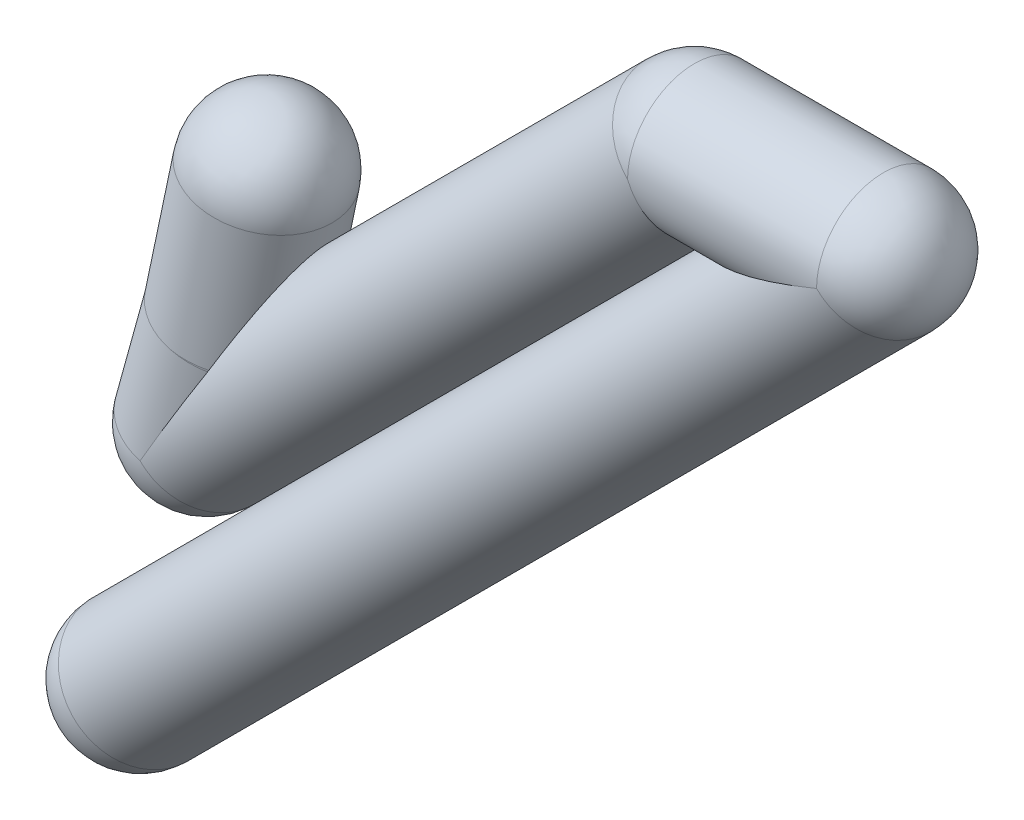
ISO-10303-21;
HEADER;
FILE_DESCRIPTION(('STEP AP214'),'2;1');
FILE_NAME('part.step','',(''),(''),'','','');
FILE_SCHEMA(('AUTOMOTIVE_DESIGN { 1 0 10303 214 1 1 1 1 }'));
ENDSEC;
DATA;
#1=APPLICATION_CONTEXT('core data for automotive mechanical design processes');
#2=APPLICATION_PROTOCOL_DEFINITION('international standard','automotive_design',2000,#1);
#3=PRODUCT_CONTEXT('',#1,'mechanical');
#4=PRODUCT('Part','Part','',(#3));
#5=PRODUCT_RELATED_PRODUCT_CATEGORY('part','',(#4));
#6=PRODUCT_DEFINITION_FORMATION('','',#4);
#7=PRODUCT_DEFINITION_CONTEXT('part definition',#1,'design');
#8=PRODUCT_DEFINITION('design','',#6,#7);
#9=PRODUCT_DEFINITION_SHAPE('','',#8);
#10=(LENGTH_UNIT() NAMED_UNIT(*) SI_UNIT(.MILLI.,.METRE.));
#11=(NAMED_UNIT(*) PLANE_ANGLE_UNIT() SI_UNIT($,.RADIAN.));
#12=(NAMED_UNIT(*) SI_UNIT($,.STERADIAN.) SOLID_ANGLE_UNIT());
#13=UNCERTAINTY_MEASURE_WITH_UNIT(LENGTH_MEASURE(1.E-05),#10,'distance_accuracy_value','');
#14=(GEOMETRIC_REPRESENTATION_CONTEXT(3) GLOBAL_UNCERTAINTY_ASSIGNED_CONTEXT((#13)) GLOBAL_UNIT_ASSIGNED_CONTEXT((#10,
#11,#12)) REPRESENTATION_CONTEXT('',''));
#15=CARTESIAN_POINT('',(0.,0.,0.));
#16=DIRECTION('',(0.,0.,1.));
#17=DIRECTION('',(1.,0.,0.));
#18=AXIS2_PLACEMENT_3D('',#15,#16,#17);
#19=CARTESIAN_POINT('',(12.435,-1.175,0.225));
#20=DIRECTION('',(1.,0.,0.));
#21=DIRECTION('',(0.,-1.,0.));
#22=AXIS2_PLACEMENT_3D('',#19,#20,#21);
#23=SPHERICAL_SURFACE('',#22,0.24);
#24=CARTESIAN_POINT('',(12.435,-1.175,0.225));
#25=DIRECTION('',(-0.706974177949316,-0.707239359561449,0.));
#26=DIRECTION('',(0.707239359561449,-0.706974177949316,0.));
#27=AXIS2_PLACEMENT_3D('',#24,#25,#26);
#28=SPHERICAL_SURFACE('',#27,0.24);
#29=CARTESIAN_POINT('',(12.435,-1.175,0.225));
#30=DIRECTION('',(-0.706974177949316,-0.707239359561449,0.));
#31=DIRECTION('',(0.707239359561449,-0.706974177949316,0.));
#32=AXIS2_PLACEMENT_3D('',#29,#30,#31);
#33=CIRCLE('',#32,0.24);
#34=CARTESIAN_POINT('',(12.6047374462947,-1.34467380270784,0.225));
#35=VERTEX_POINT('',#34);
#36=EDGE_CURVE('E191',#35,#35,#33,.F.);
#37=ORIENTED_EDGE('',*,*,#36,.F.);
#38=EDGE_LOOP('',(#37));
#39=FACE_BOUND('',#38,.T.);
#40=ADVANCED_FACE('F63',(#39),#28,.T.);
#41=CARTESIAN_POINT('',(15.101,1.492,0.225));
#42=DIRECTION('',(-0.706974177949316,-0.707239359561449,0.));
#43=DIRECTION('',(0.707239359561449,-0.706974177949316,0.));
#44=AXIS2_PLACEMENT_3D('',#41,#42,#43);
#45=CYLINDRICAL_SURFACE('',#44,0.24);
#46=CARTESIAN_POINT('',(15.101,1.492,0.225));
#47=DIRECTION('',(0.382770049801891,-0.923843649637025,0.));
#48=DIRECTION('',(-0.923843649637025,-0.382770049801891,0.));
#49=AXIS2_PLACEMENT_3D('',#46,#47,#48);
#50=ELLIPSE('',#49,0.627008304657629,0.24);
#51=CARTESIAN_POINT('',(15.101,1.492,-0.0149999999999997));
#52=VERTEX_POINT('',#51);
#53=CARTESIAN_POINT('',(14.5223132753196,1.25223654379976,0.214347062801731));
#54=VERTEX_POINT('',#53);
#55=EDGE_CURVE('E12',#52,#54,#50,.F.);
#56=ORIENTED_EDGE('',*,*,#55,.F.);
#57=CARTESIAN_POINT('',(15.101,1.492,0.225));
#58=DIRECTION('',(-0.706974177949316,-0.70723935956145,0.));
#59=DIRECTION('',(0.70723935956145,-0.706974177949316,0.));
#60=AXIS2_PLACEMENT_3D('',#57,#58,#59);
#61=CIRCLE('',#60,0.24);
#62=CARTESIAN_POINT('',(15.101,1.492,0.465));
#63=VERTEX_POINT('',#62);
#64=EDGE_CURVE('E227',#52,#63,#61,.T.);
#65=ORIENTED_EDGE('',*,*,#64,.T.);
#66=CARTESIAN_POINT('',(14.5223132753196,1.25223654379976,0.23565293719827));
#67=VERTEX_POINT('',#66);
#68=EDGE_CURVE('E66',#67,#63,#50,.F.);
#69=ORIENTED_EDGE('',*,*,#68,.F.);
#70=CARTESIAN_POINT('',(14.9314682197368,1.66146821379146,0.236811011603823));
#71=CARTESIAN_POINT('',(14.8183427360793,1.54832151715833,0.236488224077256));
#72=CARTESIAN_POINT('',(14.7052163180333,1.4351738855468,0.23617682598939));
#73=CARTESIAN_POINT('',(14.1395818946467,0.869433392363839,0.234588605074432));
#74=CARTESIAN_POINT('',(13.6870671805086,0.41683381614354,0.23321809159383));
#75=CARTESIAN_POINT('',(13.1214537669255,-0.148885666864555,0.229969189347473));
#76=CARTESIAN_POINT('',(13.0083325481308,-0.262028099141983,0.229242620613769));
#77=CARTESIAN_POINT('',(12.8669184797727,-0.403468686772225,0.227887374110751));
#78=CARTESIAN_POINT('',(12.8386350322976,-0.431757438223951,0.227593972954162));
#79=CARTESIAN_POINT('',(12.7962215950744,-0.474178829209746,0.226911692363441));
#80=CARTESIAN_POINT('',(12.7820857261761,-0.488317348997526,0.226643902022688));
#81=CARTESIAN_POINT('',(12.7608676213372,-0.509539432852718,0.226232529619917));
#82=CARTESIAN_POINT('',(12.7537925004014,-0.516615880581045,0.226093790279123));
#83=CARTESIAN_POINT('',(12.7449690660367,-0.525440969598245,0.225633277261518));
#84=CARTESIAN_POINT('',(12.7432053795292,-0.527204986848572,0.225526818515828));
#85=CARTESIAN_POINT('',(12.7405492381249,-0.529861626357267,0.225388538380854));
#86=CARTESIAN_POINT('',(12.739661952098,-0.530749078776298,0.225346008117668));
#87=CARTESIAN_POINT('',(12.7387444201222,-0.531666782816224,0.225132799291907));
#88=CARTESIAN_POINT('',(12.7386983807429,-0.53171283082918,0.225121643381271));
#89=CARTESIAN_POINT('',(12.7386088367159,-0.531802391648367,0.225096471005449));
#90=CARTESIAN_POINT('',(12.7385653242321,-0.531845912292002,0.225082632522319));
#91=CARTESIAN_POINT('',(12.7385155956249,-0.531895650224798,0.225055706880137));
#92=CARTESIAN_POINT('',(12.7385073560824,-0.531903891312463,0.225050852562478));
#93=CARTESIAN_POINT('',(12.7384953539923,-0.531915895653329,0.225042721838669));
#94=CARTESIAN_POINT('',(12.7384914412664,-0.531919809112953,0.225039894687656));
#95=CARTESIAN_POINT('',(12.7384839703982,-0.531927281382133,0.225033485219596));
#96=CARTESIAN_POINT('',(12.7384804083032,-0.531930844145171,0.22502991321194));
#97=CARTESIAN_POINT('',(12.7384756084548,-0.53193564489371,0.225023670897794));
#98=CARTESIAN_POINT('',(12.7384740947542,-0.531937158878101,0.225021433415075));
#99=CARTESIAN_POINT('',(12.7384712937224,-0.531939960435161,0.225016625320485));
#100=CARTESIAN_POINT('',(12.7384700109189,-0.531941243479265,0.225014049470903));
#101=CARTESIAN_POINT('',(12.7384688918341,-0.531942362773904,0.225011324918011));
#102=B_SPLINE_CURVE_WITH_KNOTS('',3,(#70,#71,#72,#73,#74,#75,#76,#77,#78,#79,#80,#81,#82,#83,
#84,#85,#86,#87,#88,#89,#90,#91,#92,#93,#94,#95,#96,#97,#98,#99,#100,#101),.UNSPECIFIED.,.F.,
.F.,(4,2,2,2,2,2,2,2,2,2,2,2,2,2,2,4),(0.,0.480000001542519,2.40000041882713,2.88000072135491,
3.00000083409713,3.0600009937003,3.09000137629971,3.09750160234522,3.1012528666637,
3.10145123990264,3.10163934376289,3.10167716454526,3.10169579370444,3.10171418035983,
3.10172343821629,3.10173286148149),.UNSPECIFIED.);
#103=CARTESIAN_POINT('',(12.8436957607435,-0.426695760743489,0.227587966649211));
#104=VERTEX_POINT('',#103);
#105=EDGE_CURVE('E190',#104,#67,#102,.F.);
#106=ORIENTED_EDGE('',*,*,#105,.F.);
#107=CARTESIAN_POINT('',(12.8439056274091,-0.426485724831419,0.222417974999876));
#108=CARTESIAN_POINT('',(12.8437558175882,-0.426635752871622,0.222407773957752));
#109=CARTESIAN_POINT('',(12.843605380402,-0.426786201255227,0.222410385210852));
#110=CARTESIAN_POINT('',(12.8433049697176,-0.427086240883698,0.222442026969654));
#111=CARTESIAN_POINT('',(12.8431550021992,-0.427235824201141,0.22247118816671));
#112=CARTESIAN_POINT('',(12.8428586155293,-0.427531067230326,0.222556888200133));
#113=CARTESIAN_POINT('',(12.8427122005311,-0.427676722369848,0.222613457599668));
#114=CARTESIAN_POINT('',(12.8424265232817,-0.427960565122993,0.222755699890907));
#115=CARTESIAN_POINT('',(12.8422872510151,-0.428098763207891,0.222841330672941));
#116=CARTESIAN_POINT('',(12.8420492256553,-0.428334684829849,0.223022220066676));
#117=CARTESIAN_POINT('',(12.841948199591,-0.428434721414641,0.223111448516432));
#118=CARTESIAN_POINT('',(12.841756798195,-0.428624095751787,0.223310503694806));
#119=CARTESIAN_POINT('',(12.8416664105508,-0.42871344587437,0.2234203062221));
#120=CARTESIAN_POINT('',(12.8415195712046,-0.428858501244046,0.223634132884437));
#121=CARTESIAN_POINT('',(12.841460050616,-0.428917262170442,0.223733958724017));
#122=CARTESIAN_POINT('',(12.8413531537831,-0.429022751060094,0.223945783771238));
#123=CARTESIAN_POINT('',(12.8413057619872,-0.429069494432803,0.224057767125107));
#124=CARTESIAN_POINT('',(12.8412328376988,-0.429141399516102,0.224273029206016));
#125=CARTESIAN_POINT('',(12.8412050033806,-0.429168835046396,0.22437476052546));
#126=CARTESIAN_POINT('',(12.8411618457487,-0.429211368603448,0.224583348138769));
#127=CARTESIAN_POINT('',(12.8411465148304,-0.429226474129413,0.224690201275568));
#128=CARTESIAN_POINT('',(12.8411294766015,-0.429243261608479,0.224906405058688));
#129=CARTESIAN_POINT('',(12.8411278129923,-0.429244900501776,0.225015762596112));
#130=CARTESIAN_POINT('',(12.8411383529091,-0.429234515978237,0.225233146125982));
#131=CARTESIAN_POINT('',(12.8411505578406,-0.429222491176486,0.22534117198233));
#132=CARTESIAN_POINT('',(12.8411870017847,-0.429186577250152,0.22554756229951));
#133=CARTESIAN_POINT('',(12.8412106349595,-0.429163285398775,0.225646141611362));
#134=CARTESIAN_POINT('',(12.8412681637254,-0.429106569872316,0.225837154699135));
#135=CARTESIAN_POINT('',(12.8413020635197,-0.429073142047532,0.225929585939081));
#136=CARTESIAN_POINT('',(12.8413932609923,-0.428983180331792,0.22614124759041));
#137=CARTESIAN_POINT('',(12.8414545417689,-0.428922705726902,0.226257090312253));
#138=CARTESIAN_POINT('',(12.8415895886472,-0.4287893476244,0.226473304368881));
#139=CARTESIAN_POINT('',(12.8416633787629,-0.428716440258136,0.226573645223108));
#140=CARTESIAN_POINT('',(12.841849340332,-0.428532566984268,0.226793435564337));
#141=CARTESIAN_POINT('',(12.8419655613459,-0.428417549096315,0.226906051133798));
#142=CARTESIAN_POINT('',(12.8422090607881,-0.428176297011629,0.227103941763001));
#143=CARTESIAN_POINT('',(12.8423363607114,-0.428050040999521,0.227189162097253));
#144=CARTESIAN_POINT('',(12.8426425940775,-0.42774595552679,0.227358949371644));
#145=CARTESIAN_POINT('',(12.8428243050935,-0.427565247092539,0.227433339147744));
#146=CARTESIAN_POINT('',(12.8431932310079,-0.427197741072841,0.227539706716952));
#147=CARTESIAN_POINT('',(12.8433804421489,-0.427010947635475,0.227571712807357));
#148=CARTESIAN_POINT('',(12.8436806056503,-0.426710956288929,0.227590158479851));
#149=CARTESIAN_POINT('',(12.8437933070486,-0.426598207813294,0.227589703873685));
#150=CARTESIAN_POINT('',(12.843905627409,-0.426485724831508,0.227582025001818));
#151=B_SPLINE_CURVE_WITH_KNOTS('',3,(#107,#108,#109,#110,#111,#112,#113,#114,#115,#116,#117,
#118,#119,#120,#121,#122,#123,#124,#125,#126,#127,#128,#129,#130,#131,#132,#133,#134,#135,#136,
#137,#138,#139,#140,#141,#142,#143,#144,#145,#146,#147,#148,#149,#150),.UNSPECIFIED.,.F.,.F.,(4,
2,2,2,2,2,2,2,2,2,2,2,2,2,2,2,2,2,2,2,2,4),(0.,0.000636595524472247,0.00127634171523936,
0.00191680294116418,0.00255634007915819,0.00305835063383241,0.00355977433817766,
0.00394907332078763,0.00433787060859252,0.00466342029977965,0.00498877184117916,
0.00531516329684514,0.00564158783760053,0.00595234198031183,0.00626322351896244,
0.00669382772165161,0.00712526811012259,0.00771764439156733,0.00831119677116011,
0.00910760295979149,0.00990347716253556,0.0103809943925168),.UNSPECIFIED.);
#152=CARTESIAN_POINT('',(12.8436957607435,-0.426695760743488,0.222412033346072));
#153=VERTEX_POINT('',#152);
#154=EDGE_CURVE('E183',#153,#104,#151,.T.);
#155=ORIENTED_EDGE('',*,*,#154,.F.);
#156=CARTESIAN_POINT('',(14.9314682197368,1.66146821379146,0.213188988396177));
#157=CARTESIAN_POINT('',(14.8183427360793,1.54832151715833,0.213511775922744));
#158=CARTESIAN_POINT('',(14.7052163180333,1.4351738855468,0.21382317401061));
#159=CARTESIAN_POINT('',(14.1395818946467,0.869433392363838,0.215411394925568));
#160=CARTESIAN_POINT('',(13.6870671805086,0.41683381614354,0.21678190840617));
#161=CARTESIAN_POINT('',(13.1214537669255,-0.148885666864555,0.220030810652527));
#162=CARTESIAN_POINT('',(13.0083325481308,-0.262028099141983,0.220757379386231));
#163=CARTESIAN_POINT('',(12.8669184797727,-0.403468686772225,0.222112625889249));
#164=CARTESIAN_POINT('',(12.8386350322976,-0.431757438223951,0.222406027045838));
#165=CARTESIAN_POINT('',(12.7962215950744,-0.474178829209746,0.223088307636559));
#166=CARTESIAN_POINT('',(12.7820857261761,-0.488317348997526,0.223356097977312));
#167=CARTESIAN_POINT('',(12.7608676213372,-0.509539432852718,0.223767470380083));
#168=CARTESIAN_POINT('',(12.7537925004014,-0.516615880581045,0.223906209720877));
#169=CARTESIAN_POINT('',(12.7449690660367,-0.525440969598245,0.224366722738482));
#170=CARTESIAN_POINT('',(12.7432053795292,-0.527204986848572,0.224473181484172));
#171=CARTESIAN_POINT('',(12.7405492381249,-0.529861626357267,0.224611461619146));
#172=CARTESIAN_POINT('',(12.739661952098,-0.530749078776298,0.224653991882332));
#173=CARTESIAN_POINT('',(12.7387444201222,-0.531666782816224,0.224867200708093));
#174=CARTESIAN_POINT('',(12.7386983807429,-0.53171283082918,0.224878356618729));
#175=CARTESIAN_POINT('',(12.7386088367159,-0.531802391648367,0.224903528994551));
#176=CARTESIAN_POINT('',(12.7385653242321,-0.531845912292002,0.224917367477681));
#177=CARTESIAN_POINT('',(12.7385155956249,-0.531895650224798,0.224944293119863));
#178=CARTESIAN_POINT('',(12.7385073560824,-0.531903891312463,0.224949147437522));
#179=CARTESIAN_POINT('',(12.7384953539923,-0.531915895653329,0.224957278161331));
#180=CARTESIAN_POINT('',(12.7384914412664,-0.531919809112953,0.224960105312344));
#181=CARTESIAN_POINT('',(12.7384839703982,-0.531927281382133,0.224966514780404));
#182=CARTESIAN_POINT('',(12.7384804083032,-0.531930844145171,0.22497008678806));
#183=CARTESIAN_POINT('',(12.7384756084548,-0.53193564489371,0.224976329102206));
#184=CARTESIAN_POINT('',(12.7384740947542,-0.531937158878101,0.224978566584925));
#185=CARTESIAN_POINT('',(12.7384712937224,-0.531939960435161,0.224983374679515));
#186=CARTESIAN_POINT('',(12.7384700109189,-0.531941243479265,0.224985950529097));
#187=CARTESIAN_POINT('',(12.7384688918341,-0.531942362773904,0.224988675081989));
#188=B_SPLINE_CURVE_WITH_KNOTS('',3,(#156,#157,#158,#159,#160,#161,#162,#163,#164,#165,#166,
#167,#168,#169,#170,#171,#172,#173,#174,#175,#176,#177,#178,#179,#180,#181,#182,#183,#184,#185,
#186,#187),.UNSPECIFIED.,.F.,.F.,(4,2,2,2,2,2,2,2,2,2,2,2,2,2,2,4),(0.,0.480000001542519,
2.40000041882713,2.88000072135491,3.00000083409713,3.0600009937003,3.09000137629971,
3.09750160234522,3.1012528666637,3.10145123990264,3.10163934376289,3.10167716454526,
3.10169579370444,3.10171418035983,3.10172343821629,3.10173286148149),.UNSPECIFIED.);
#189=EDGE_CURVE('E77',#54,#153,#188,.T.);
#190=ORIENTED_EDGE('',*,*,#189,.F.);
#191=EDGE_LOOP('',(#56,#65,#69,#106,#155,#190));
#192=FACE_BOUND('',#191,.T.);
#193=ORIENTED_EDGE('',*,*,#36,.T.);
#194=EDGE_LOOP('',(#193));
#195=FACE_BOUND('',#194,.T.);
#196=ADVANCED_FACE('F196',(#192,#195),#45,.T.);
#197=CARTESIAN_POINT('',(15.101,1.492,0.225));
#198=DIRECTION('',(1.,0.,0.));
#199=DIRECTION('',(0.,-1.,0.));
#200=AXIS2_PLACEMENT_3D('',#197,#198,#199);
#201=SPHERICAL_SURFACE('',#200,0.24);
#202=ORIENTED_EDGE('',*,*,#64,.F.);
#203=CARTESIAN_POINT('',(15.101,1.492,0.225));
#204=DIRECTION('',(1.,0.,0.));
#205=DIRECTION('',(0.,0.,-1.));
#206=AXIS2_PLACEMENT_3D('',#203,#204,#205);
#207=CIRCLE('',#206,0.24);
#208=EDGE_CURVE('E225',#63,#52,#207,.F.);
#209=ORIENTED_EDGE('',*,*,#208,.F.);
#210=EDGE_LOOP('',(#202,#209));
#211=FACE_BOUND('',#210,.T.);
#212=ADVANCED_FACE('F200',(#211),#201,.T.);
#213=CARTESIAN_POINT('',(14.423,1.492,0.225));
#214=DIRECTION('',(1.,0.,0.));
#215=DIRECTION('',(0.,0.,-1.));
#216=AXIS2_PLACEMENT_3D('',#213,#214,#215);
#217=CYLINDRICAL_SURFACE('',#216,0.24);
#218=ORIENTED_EDGE('',*,*,#208,.T.);
#219=ORIENTED_EDGE('',*,*,#55,.T.);
#220=CARTESIAN_POINT('',(14.423,1.492,0.225));
#221=DIRECTION('',(0.923879532511287,0.38268343236509,0.));
#222=DIRECTION('',(0.38268343236509,-0.923879532511287,0.));
#223=AXIS2_PLACEMENT_3D('',#220,#221,#222);
#224=ELLIPSE('',#223,0.259774128070175,0.24);
#225=CARTESIAN_POINT('',(14.423,1.492,-0.015));
#226=VERTEX_POINT('',#225);
#227=EDGE_CURVE('E224',#226,#54,#224,.F.);
#228=ORIENTED_EDGE('',*,*,#227,.F.);
#229=CARTESIAN_POINT('',(14.423,1.492,0.225));
#230=DIRECTION('',(1.,0.,0.));
#231=DIRECTION('',(0.,0.,-1.));
#232=AXIS2_PLACEMENT_3D('',#229,#230,#231);
#233=CIRCLE('',#232,0.24);
#234=CARTESIAN_POINT('',(14.423,1.492,0.465));
#235=VERTEX_POINT('',#234);
#236=EDGE_CURVE('E222',#226,#235,#233,.T.);
#237=ORIENTED_EDGE('',*,*,#236,.T.);
#238=EDGE_CURVE('E213',#67,#235,#224,.F.);
#239=ORIENTED_EDGE('',*,*,#238,.F.);
#240=ORIENTED_EDGE('',*,*,#68,.T.);
#241=EDGE_LOOP('',(#218,#219,#228,#237,#239,#240));
#242=FACE_BOUND('',#241,.T.);
#243=ADVANCED_FACE('F219',(#242),#217,.T.);
#244=CARTESIAN_POINT('',(14.423,1.492,0.225));
#245=DIRECTION('',(1.,0.,0.));
#246=DIRECTION('',(0.,-1.,0.));
#247=AXIS2_PLACEMENT_3D('',#244,#245,#246);
#248=SPHERICAL_SURFACE('',#247,0.24);
#249=ORIENTED_EDGE('',*,*,#236,.F.);
#250=CARTESIAN_POINT('',(14.423,1.492,0.225));
#251=DIRECTION('',(0.707106781186548,0.707106781186547,0.));
#252=DIRECTION('',(-0.707106781186547,0.707106781186548,0.));
#253=AXIS2_PLACEMENT_3D('',#250,#251,#252);
#254=CIRCLE('',#253,0.24);
#255=EDGE_CURVE('E334',#235,#226,#254,.F.);
#256=ORIENTED_EDGE('',*,*,#255,.F.);
#257=EDGE_LOOP('',(#249,#256));
#258=FACE_BOUND('',#257,.T.);
#259=ADVANCED_FACE('F253',(#258),#248,.T.);
#260=CARTESIAN_POINT('',(12.674,-0.257,0.225));
#261=DIRECTION('',(0.707106781186548,0.707106781186547,0.));
#262=DIRECTION('',(-0.707106781186547,0.707106781186548,0.));
#263=AXIS2_PLACEMENT_3D('',#260,#261,#262);
#264=CYLINDRICAL_SURFACE('',#263,0.24);
#265=ORIENTED_EDGE('',*,*,#227,.T.);
#266=ORIENTED_EDGE('',*,*,#189,.T.);
#267=CARTESIAN_POINT('',(12.674,-0.257,0.225));
#268=DIRECTION('',(0.707106781186548,0.707106781186547,0.));
#269=DIRECTION('',(-0.707106781186547,0.707106781186548,0.));
#270=AXIS2_PLACEMENT_3D('',#267,#268,#269);
#271=CIRCLE('',#270,0.24);
#272=CARTESIAN_POINT('',(12.674,-0.256999999999999,-0.015));
#273=VERTEX_POINT('',#272);
#274=EDGE_CURVE('E154',#153,#273,#271,.T.);
#275=ORIENTED_EDGE('',*,*,#274,.T.);
#276=CARTESIAN_POINT('',(12.674,-0.257,0.225));
#277=DIRECTION('',(0.86437903274213,-0.502840817511645,0.));
#278=DIRECTION('',(0.502840817511644,0.864379032742131,0.));
#279=AXIS2_PLACEMENT_3D('',#276,#277,#278);
#280=ELLIPSE('',#279,0.938797727795282,0.24);
#281=CARTESIAN_POINT('',(12.8897732493297,0.11391235643334,0.0115382265519018));
#282=VERTEX_POINT('',#281);
#283=EDGE_CURVE('E357',#282,#273,#280,.F.);
#284=ORIENTED_EDGE('',*,*,#283,.F.);
#285=CARTESIAN_POINT('',(12.9205738351043,0.197560846006869,0.0353405640419861));
#286=CARTESIAN_POINT('',(12.9183225747043,0.186575016180927,0.0305466126864104));
#287=CARTESIAN_POINT('',(12.9154695719162,0.17538127085268,0.0264619755662296));
#288=CARTESIAN_POINT('',(12.9084024922985,0.153362546969109,0.019678380973907));
#289=CARTESIAN_POINT('',(12.904226502901,0.142535659196486,0.0169455594842373));
#290=CARTESIAN_POINT('',(12.8948407451149,0.122630019487927,0.0128452322547191));
#291=CARTESIAN_POINT('',(12.8898075147527,0.113494333865105,0.0113559667974857));
#292=CARTESIAN_POINT('',(12.8783174934142,0.0957513335911109,0.00915730582332255));
#293=CARTESIAN_POINT('',(12.8718295295743,0.0871618856356583,0.0084674177226577));
#294=CARTESIAN_POINT('',(12.8646514656446,0.0791374440749365,0.00816615799166989));
#295=B_SPLINE_CURVE_WITH_KNOTS('',3,(#285,#286,#287,#288,#289,#290,#291,#292,#293,#294),
.UNSPECIFIED.,.F.,.F.,(4,2,2,2,4),(0.,0.0365849774065427,0.0722000791842796,0.103676228836804,
0.135905318300953),.UNSPECIFIED.);
#296=CARTESIAN_POINT('',(12.8931747613077,0.119969218709931,0.0125136366573816));
#297=VERTEX_POINT('',#296);
#298=EDGE_CURVE('E130',#297,#282,#295,.T.);
#299=ORIENTED_EDGE('',*,*,#298,.F.);
#300=CARTESIAN_POINT('',(12.7064678663239,-0.224532133676094,0.225));
#301=DIRECTION('',(0.879182932883338,-0.476484386445823,0.));
#302=DIRECTION('',(0.476484386445823,0.879182932883338,0.));
#303=AXIS2_PLACEMENT_3D('',#300,#301,#302);
#304=ELLIPSE('',#303,0.84284201662051,0.24);
#305=CARTESIAN_POINT('',(12.8931747613077,0.119969218709931,0.437486363342618));
#306=VERTEX_POINT('',#305);
#307=EDGE_CURVE('E145',#306,#297,#304,.F.);
#308=ORIENTED_EDGE('',*,*,#307,.F.);
#309=CARTESIAN_POINT('',(12.8646514656446,0.0791374440749326,0.441833842008321));
#310=CARTESIAN_POINT('',(12.8727765111331,0.0882055995671705,0.441491841549894));
#311=CARTESIAN_POINT('',(12.8800040577637,0.0979986921320614,0.440655067374151));
#312=CARTESIAN_POINT('',(12.8925725607413,0.118247367564999,0.437927438315276));
#313=CARTESIAN_POINT('',(12.8979576206087,0.128679153619646,0.436064510151972));
#314=CARTESIAN_POINT('',(12.9066641551244,0.148790650696969,0.431474611325304));
#315=CARTESIAN_POINT('',(12.910145978241,0.158429419577756,0.428863098994067));
#316=CARTESIAN_POINT('',(12.9161144081229,0.177950715432335,0.422588632685667));
#317=CARTESIAN_POINT('',(12.9185753372586,0.187833580498777,0.418902118301608));
#318=CARTESIAN_POINT('',(12.9205738351043,0.19756084600687,0.414659435958017));
#319=B_SPLINE_CURVE_WITH_KNOTS('',3,(#309,#310,#311,#312,#313,#314,#315,#316,#317,#318),
.UNSPECIFIED.,.F.,.F.,(4,2,2,2,4),(0.,0.0364169219231171,0.0718884982309517,0.103517594772023,
0.135899987866702),.UNSPECIFIED.);
#320=CARTESIAN_POINT('',(12.8897732493171,0.113912356437795,0.438461773441753));
#321=VERTEX_POINT('',#320);
#322=EDGE_CURVE('E337',#321,#306,#319,.T.);
#323=ORIENTED_EDGE('',*,*,#322,.F.);
#324=CARTESIAN_POINT('',(12.674,-0.256999999999999,0.465));
#325=VERTEX_POINT('',#324);
#326=EDGE_CURVE('E358',#325,#321,#280,.F.);
#327=ORIENTED_EDGE('',*,*,#326,.F.);
#328=EDGE_CURVE('E216',#325,#104,#271,.T.);
#329=ORIENTED_EDGE('',*,*,#328,.T.);
#330=ORIENTED_EDGE('',*,*,#105,.T.);
#331=ORIENTED_EDGE('',*,*,#238,.T.);
#332=ORIENTED_EDGE('',*,*,#255,.T.);
#333=EDGE_LOOP('',(#265,#266,#275,#284,#299,#308,#323,#327,#329,#330,#331,#332));
#334=FACE_BOUND('',#333,.T.);
#335=ADVANCED_FACE('F178',(#334),#264,.T.);
#336=CARTESIAN_POINT('',(12.674,-0.257,0.225));
#337=DIRECTION('',(1.,0.,0.));
#338=DIRECTION('',(0.,-1.,0.));
#339=AXIS2_PLACEMENT_3D('',#336,#337,#338);
#340=SPHERICAL_SURFACE('',#339,0.24);
#341=ORIENTED_EDGE('',*,*,#274,.F.);
#342=ORIENTED_EDGE('',*,*,#154,.T.);
#343=ORIENTED_EDGE('',*,*,#328,.F.);
#344=CARTESIAN_POINT('',(12.674,-0.257,0.225));
#345=DIRECTION('',(-0.265156483021044,-0.96420539280379,0.));
#346=DIRECTION('',(0.96420539280379,-0.265156483021044,0.));
#347=AXIS2_PLACEMENT_3D('',#344,#345,#346);
#348=CIRCLE('',#347,0.24);
#349=EDGE_CURVE('E134',#273,#325,#348,.F.);
#350=ORIENTED_EDGE('',*,*,#349,.F.);
#351=EDGE_LOOP('',(#341,#342,#343,#350));
#352=FACE_BOUND('',#351,.T.);
#353=ADVANCED_FACE('F174',(#352),#340,.T.);
#354=CARTESIAN_POINT('',(12.784,0.143,0.225));
#355=DIRECTION('',(1.,0.,0.));
#356=DIRECTION('',(0.,-1.,0.));
#357=AXIS2_PLACEMENT_3D('',#354,#355,#356);
#358=SPHERICAL_SURFACE('',#357,0.24);
#359=CARTESIAN_POINT('',(12.784,0.143,0.225));
#360=DIRECTION('',(-0.206410565926552,-0.978465471170997,0.));
#361=DIRECTION('',(0.978465471170997,-0.206410565926552,0.));
#362=AXIS2_PLACEMENT_3D('',#359,#360,#361);
#363=CIRCLE('',#362,0.240000000000001);
#364=CARTESIAN_POINT('',(12.784,0.142999999999998,-0.0150000000000004));
#365=VERTEX_POINT('',#364);
#366=EDGE_CURVE('E129',#365,#297,#363,.T.);
#367=ORIENTED_EDGE('',*,*,#366,.T.);
#368=ORIENTED_EDGE('',*,*,#298,.T.);
#369=CARTESIAN_POINT('',(12.784,0.143,0.225));
#370=DIRECTION('',(-0.265156483021036,-0.964205392803792,0.));
#371=DIRECTION('',(0.964205392803792,-0.265156483021036,0.));
#372=AXIS2_PLACEMENT_3D('',#369,#370,#371);
#373=CIRCLE('',#372,0.24);
#374=EDGE_CURVE('E126',#365,#282,#373,.T.);
#375=ORIENTED_EDGE('',*,*,#374,.F.);
#376=EDGE_LOOP('',(#367,#368,#375));
#377=FACE_BOUND('',#376,.T.);
#378=ADVANCED_FACE('F128',(#377),#358,.T.);
#379=CARTESIAN_POINT('',(12.784,0.143,0.225));
#380=DIRECTION('',(-0.265156483021044,-0.96420539280379,0.));
#381=DIRECTION('',(0.96420539280379,-0.265156483021044,0.));
#382=AXIS2_PLACEMENT_3D('',#379,#380,#381);
#383=CYLINDRICAL_SURFACE('',#382,0.24);
#384=ORIENTED_EDGE('',*,*,#349,.T.);
#385=ORIENTED_EDGE('',*,*,#326,.T.);
#386=CARTESIAN_POINT('',(12.784,0.142999999999998,0.465));
#387=VERTEX_POINT('',#386);
#388=EDGE_CURVE('E135',#321,#387,#373,.T.);
#389=ORIENTED_EDGE('',*,*,#388,.T.);
#390=CARTESIAN_POINT('',(12.784,0.142999999999969,0.465));
#391=CARTESIAN_POINT('',(12.7801821369884,0.143926754318084,0.465000083439855));
#392=CARTESIAN_POINT('',(12.7763647177572,0.144855309159675,0.464903622841527));
#393=CARTESIAN_POINT('',(12.7687399818555,0.146713489487149,0.464518201468328));
#394=CARTESIAN_POINT('',(12.7649326649084,0.147643114942701,0.464229246019006));
#395=CARTESIAN_POINT('',(12.7573372380074,0.149500932778714,0.463459433089209));
#396=CARTESIAN_POINT('',(12.7535491275418,0.150429125196876,0.462978580746894));
#397=CARTESIAN_POINT('',(12.7460011686286,0.152281586822051,0.461826158950316));
#398=CARTESIAN_POINT('',(12.742241319452,0.153205856129984,0.461154594432658));
#399=CARTESIAN_POINT('',(12.7347588738815,0.155047999071177,0.459622359307577));
#400=CARTESIAN_POINT('',(12.7310362765589,0.155965872863696,0.458761693426621));
#401=CARTESIAN_POINT('',(12.7236372376764,0.157792776451099,0.456853331102958));
#402=CARTESIAN_POINT('',(12.7199607950062,0.158701806458591,0.455805639168217));
#403=CARTESIAN_POINT('',(12.7126628596755,0.160508604054618,0.453525748440169));
#404=CARTESIAN_POINT('',(12.7090413657416,0.161406371904049,0.452293553929584));
#405=CARTESIAN_POINT('',(12.7018619920775,0.163188262527133,0.449647626883248));
#406=CARTESIAN_POINT('',(12.6983041109294,0.164072385604856,0.448233898399504));
#407=CARTESIAN_POINT('',(12.6912604761417,0.16582464552232,0.445228309404114));
#408=CARTESIAN_POINT('',(12.6877747209583,0.166692782704165,0.443636452709651));
#409=CARTESIAN_POINT('',(12.6808836799964,0.168410776804909,0.440278442465758));
#410=CARTESIAN_POINT('',(12.677478392567,0.169260634098799,0.438512292495917));
#411=CARTESIAN_POINT('',(12.6707564375081,0.170939827061615,0.43480995075144));
#412=CARTESIAN_POINT('',(12.6674397681391,0.171769163133289,0.432873762317363));
#413=CARTESIAN_POINT('',(12.6609029884589,0.173405130352332,0.428836008335937));
#414=CARTESIAN_POINT('',(12.6576828763383,0.174211761925113,0.426734445889996));
#415=CARTESIAN_POINT('',(12.6513469201499,0.1758002001693,0.422371006975132));
#416=CARTESIAN_POINT('',(12.6482310742211,0.176582007283753,0.420109133369648));
#417=CARTESIAN_POINT('',(12.6421111105771,0.178118745063589,0.41543052142774));
#418=CARTESIAN_POINT('',(12.6391069909673,0.178873676184706,0.413013785719246));
#419=CARTESIAN_POINT('',(12.6332176733166,0.180354683801777,0.40803127193629));
#420=CARTESIAN_POINT('',(12.630332473365,0.181080760761307,0.405465496257958));
#421=CARTESIAN_POINT('',(12.6246879042509,0.182502160016173,0.40019108394606));
#422=CARTESIAN_POINT('',(12.621928533179,0.183197482778205,0.397482449481743));
#423=CARTESIAN_POINT('',(12.6165422302654,0.184555556313325,0.391928845162144));
#424=CARTESIAN_POINT('',(12.6139152965321,0.185218307551648,0.389083877255331));
#425=CARTESIAN_POINT('',(12.6088001600379,0.186509507806815,0.38326446004727));
#426=CARTESIAN_POINT('',(12.6063119554192,0.18713795728302,0.380290012480947));
#427=CARTESIAN_POINT('',(12.6014802370407,0.188358915041749,0.374218801870196));
#428=CARTESIAN_POINT('',(12.5991367214723,0.188951423773526,0.371122040355471));
#429=CARTESIAN_POINT('',(12.5945999948678,0.190098956279791,0.364813662420164));
#430=CARTESIAN_POINT('',(12.592406782087,0.190653980489386,0.361602047333426));
#431=CARTESIAN_POINT('',(12.5881759149948,0.191725099115155,0.355071699508554));
#432=CARTESIAN_POINT('',(12.5861382590165,0.19224119394847,0.351752967918754));
#433=CARTESIAN_POINT('',(12.5822233870736,0.193233111393576,0.345016382384218));
#434=CARTESIAN_POINT('',(12.5803461695329,0.19370893440095,0.341598529413578));
#435=CARTESIAN_POINT('',(12.5767566718572,0.194619071407937,0.334671935193982));
#436=CARTESIAN_POINT('',(12.5750443902493,0.195053385778231,0.331163194757028));
#437=CARTESIAN_POINT('',(12.5717888668448,0.195879377346014,0.324063278624545));
#438=CARTESIAN_POINT('',(12.5702456236897,0.196271054886197,0.320472103591866));
#439=CARTESIAN_POINT('',(12.5673318747281,0.197010755967556,0.313215969866337));
#440=CARTESIAN_POINT('',(12.5659613676876,0.197358779820625,0.309551011700862));
#441=CARTESIAN_POINT('',(12.5633963747172,0.198010270489812,0.302156141043993));
#442=CARTESIAN_POINT('',(12.5622018876868,0.19831373758449,0.298426228958841));
#443=CARTESIAN_POINT('',(12.559991796813,0.198875327662498,0.290910436261759));
#444=CARTESIAN_POINT('',(12.5589761920109,0.199133450888816,0.287124555949871));
#445=CARTESIAN_POINT('',(12.55712629909,0.199603684015167,0.27950594741549));
#446=CARTESIAN_POINT('',(12.5562920101614,0.199815794120682,0.275673219402288));
#447=CARTESIAN_POINT('',(12.5548067480422,0.200193451261929,0.267970148925877));
#448=CARTESIAN_POINT('',(12.5541557741966,0.200358998464013,0.264099806597103));
#449=CARTESIAN_POINT('',(12.5530387020416,0.200643100850497,0.25633083155015));
#450=CARTESIAN_POINT('',(12.5525726032367,0.200761656160812,0.252432198907806));
#451=CARTESIAN_POINT('',(12.5518263979474,0.200951467644605,0.244616035431682));
#452=CARTESIAN_POINT('',(12.5515462911308,0.201022723902575,0.240698504631675));
#453=CARTESIAN_POINT('',(12.551172740899,0.201117752730922,0.23285398254881));
#454=CARTESIAN_POINT('',(12.5510792973172,0.201141525343711,0.228926991274405));
#455=CARTESIAN_POINT('',(12.5510792973172,0.201141525343711,0.221073008725595));
#456=CARTESIAN_POINT('',(12.551172740899,0.201117752730922,0.21714601745119));
#457=CARTESIAN_POINT('',(12.5515462911308,0.201022723902575,0.209301495368325));
#458=CARTESIAN_POINT('',(12.5518263979474,0.200951467644605,0.205383964568318));
#459=CARTESIAN_POINT('',(12.5525726032367,0.200761656160812,0.197567801092194));
#460=CARTESIAN_POINT('',(12.5530387020416,0.200643100850497,0.19366916844985));
#461=CARTESIAN_POINT('',(12.5541557741966,0.200358998464013,0.185900193402897));
#462=CARTESIAN_POINT('',(12.5548067480422,0.200193451261929,0.182029851074123));
#463=CARTESIAN_POINT('',(12.5562920101614,0.199815794120682,0.174326780597712));
#464=CARTESIAN_POINT('',(12.55712629909,0.199603684015167,0.170494052584511));
#465=CARTESIAN_POINT('',(12.5589761920109,0.199133450888816,0.162875444050129));
#466=CARTESIAN_POINT('',(12.559991796813,0.198875327662498,0.159089563738241));
#467=CARTESIAN_POINT('',(12.5622018876868,0.19831373758449,0.151573771041159));
#468=CARTESIAN_POINT('',(12.5633963747172,0.198010270489812,0.147843858956007));
#469=CARTESIAN_POINT('',(12.5659613676876,0.197358779820625,0.140448988299139));
#470=CARTESIAN_POINT('',(12.5673318747281,0.197010755967556,0.136784030133663));
#471=CARTESIAN_POINT('',(12.5702456236897,0.196271054886197,0.129527896408134));
#472=CARTESIAN_POINT('',(12.5717888668448,0.195879377346014,0.125936721375455));
#473=CARTESIAN_POINT('',(12.5750443902493,0.195053385778231,0.118836805242972));
#474=CARTESIAN_POINT('',(12.5767566718572,0.194619071407937,0.115328064806018));
#475=CARTESIAN_POINT('',(12.5803461695329,0.19370893440095,0.108401470586422));
#476=CARTESIAN_POINT('',(12.5822233870736,0.193233111393576,0.104983617615783));
#477=CARTESIAN_POINT('',(12.5861382590165,0.19224119394847,0.098247032081246));
#478=CARTESIAN_POINT('',(12.5881759149948,0.191725099115155,0.0949283004914459));
#479=CARTESIAN_POINT('',(12.592406782087,0.190653980489386,0.0883979526665746));
#480=CARTESIAN_POINT('',(12.5945999948678,0.190098956279791,0.0851863375798361));
#481=CARTESIAN_POINT('',(12.5991367214723,0.188951423773526,0.0788779596445291));
#482=CARTESIAN_POINT('',(12.6014802370407,0.188358915041749,0.075781198129804));
#483=CARTESIAN_POINT('',(12.6063119554192,0.18713795728302,0.0697099875190535));
#484=CARTESIAN_POINT('',(12.6088001600379,0.186509507806815,0.0667355399527299));
#485=CARTESIAN_POINT('',(12.6139152965321,0.185218307551648,0.0609161227446693));
#486=CARTESIAN_POINT('',(12.6165422302654,0.184555556313325,0.0580711548378556));
#487=CARTESIAN_POINT('',(12.621928533179,0.183197482778205,0.0525175505182566));
#488=CARTESIAN_POINT('',(12.6246879042509,0.182502160016173,0.0498089160539404));
#489=CARTESIAN_POINT('',(12.630332473365,0.181080760761307,0.0445345037420422));
#490=CARTESIAN_POINT('',(12.6332176733166,0.180354683801777,0.0419687280637099));
#491=CARTESIAN_POINT('',(12.6391069909673,0.178873676184706,0.0369862142807541));
#492=CARTESIAN_POINT('',(12.6421111105771,0.178118745063589,0.0345694785722605));
#493=CARTESIAN_POINT('',(12.6482310742211,0.176582007283753,0.0298908666303517));
#494=CARTESIAN_POINT('',(12.6513469201499,0.1758002001693,0.0276289930248683));
#495=CARTESIAN_POINT('',(12.6576828763383,0.174211761925113,0.0232655541100035));
#496=CARTESIAN_POINT('',(12.6609029884589,0.173405130352332,0.0211639916640628));
#497=CARTESIAN_POINT('',(12.6674397681391,0.171769163133289,0.0171262376826367));
#498=CARTESIAN_POINT('',(12.6707564375081,0.170939827061615,0.0151900492485599));
#499=CARTESIAN_POINT('',(12.677478392567,0.169260634098799,0.0114877075040834));
#500=CARTESIAN_POINT('',(12.6808836799964,0.168410776804909,0.00972155753424225));
#501=CARTESIAN_POINT('',(12.6877747209583,0.166692782704165,0.00636354729034877));
#502=CARTESIAN_POINT('',(12.6912604761417,0.16582464552232,0.00477169059588649));
#503=CARTESIAN_POINT('',(12.6983041109294,0.164072385604856,0.00176610160049592));
#504=CARTESIAN_POINT('',(12.7018619920775,0.163188262527133,0.000352373116752011));
#505=CARTESIAN_POINT('',(12.7090413657416,0.161406371904049,-0.00229355392958402));
#506=CARTESIAN_POINT('',(12.7126628596755,0.160508604054619,-0.00352574844016852));
#507=CARTESIAN_POINT('',(12.7199607950062,0.158701806458591,-0.00580563916821713));
#508=CARTESIAN_POINT('',(12.7236372376764,0.157792776451099,-0.00685333110295827));
#509=CARTESIAN_POINT('',(12.7310362765589,0.155965872863696,-0.00876169342662108));
#510=CARTESIAN_POINT('',(12.7347588738815,0.155047999071177,-0.00962235930757652));
#511=CARTESIAN_POINT('',(12.742241319452,0.153205856129984,-0.0111545944326581));
#512=CARTESIAN_POINT('',(12.7460011686286,0.152281586822051,-0.0118261589503161));
#513=CARTESIAN_POINT('',(12.7535491275418,0.150429125196876,-0.0129785807468939));
#514=CARTESIAN_POINT('',(12.7573372380074,0.149500932778714,-0.0134594330892089));
#515=CARTESIAN_POINT('',(12.7649326649084,0.147643114942701,-0.0142292460190061));
#516=CARTESIAN_POINT('',(12.7687399818555,0.146713489487149,-0.0145182014683282));
#517=CARTESIAN_POINT('',(12.7763647177572,0.144855309159676,-0.0149036228415266));
#518=CARTESIAN_POINT('',(12.7801821369884,0.143926754318084,-0.015000083439855));
#519=CARTESIAN_POINT('',(12.784,0.142999999999969,-0.0149999999999999));
#520=B_SPLINE_CURVE_WITH_KNOTS('',3,(#390,#391,#392,#393,#394,#395,#396,#397,#398,#399,#400,
#401,#402,#403,#404,#405,#406,#407,#408,#409,#410,#411,#412,#413,#414,#415,#416,#417,#418,#419,
#420,#421,#422,#423,#424,#425,#426,#427,#428,#429,#430,#431,#432,#433,#434,#435,#436,#437,#438,
#439,#440,#441,#442,#443,#444,#445,#446,#447,#448,#449,#450,#451,#452,#453,#454,#455,#456,#457,
#458,#459,#460,#461,#462,#463,#464,#465,#466,#467,#468,#469,#470,#471,#472,#473,#474,#475,#476,
#477,#478,#479,#480,#481,#482,#483,#484,#485,#486,#487,#488,#489,#490,#491,#492,#493,#494,#495,
#496,#497,#498,#499,#500,#501,#502,#503,#504,#505,#506,#507,#508,#509,#510,#511,#512,#513,#514,
#515,#516,#517,#518,#519),.UNSPECIFIED.,.F.,.F.,(4,2,2,2,2,2,2,2,2,2,2,2,2,2,2,2,2,2,2,2,2,2,2,
2,2,2,2,2,2,2,2,2,2,2,2,2,2,2,2,2,2,2,2,2,2,2,2,2,2,2,2,2,2,2,2,2,2,2,2,2,2,2,2,2,4),(0.,
0.011785008562796,0.0235696910959803,0.0353540581080516,0.0471381201083464,0.058921887607023,
0.0707053711150254,0.0824885811440556,0.0942715282065527,0.106054222815656,0.11783667548518,
0.129618896729588,0.141400897063964,0.153182687003982,0.16496427706588,0.17674567776643,
0.188526899622914,0.20030795315309,0.212088848875167,0.223869597307779,0.235650208969954,
0.247430694381083,0.2592110640609,0.270991328529446,0.282771498307045,0.294551583914273,
0.306331595871935,0.31811154470103,0.329891440922728,0.341671295058338,0.353451117629285,
0.365230919157075,0.377010710163272,0.38879050116947,0.40057030269726,0.412350125268207,
0.424129979403817,0.435909875625515,0.44768982445461,0.459469836412271,0.4712499220195,
0.483030091797098,0.494810356265645,0.506590725945462,0.518371211356591,0.530151823018766,
0.541932571451378,0.553713467173455,0.565494520703631,0.577275742560114,0.589057143260664,
0.600838733322563,0.61262052326258,0.624402523596957,0.636184744841365,0.647967197510889,
0.659749892119992,0.671532839182488,0.683316049211519,0.695099532719522,0.706883300218198,
0.718667362218493,0.730451729230563,0.742236411763749,0.754021420326545),.UNSPECIFIED.);
#521=EDGE_CURVE('E143',#387,#365,#520,.T.);
#522=ORIENTED_EDGE('',*,*,#521,.T.);
#523=ORIENTED_EDGE('',*,*,#374,.T.);
#524=ORIENTED_EDGE('',*,*,#283,.T.);
#525=EDGE_LOOP('',(#384,#385,#389,#522,#523,#524));
#526=FACE_BOUND('',#525,.T.);
#527=ADVANCED_FACE('F150',(#526),#383,.T.);
#528=ORIENTED_EDGE('',*,*,#388,.F.);
#529=ORIENTED_EDGE('',*,*,#322,.T.);
#530=EDGE_CURVE('E146',#306,#387,#363,.T.);
#531=ORIENTED_EDGE('',*,*,#530,.T.);
#532=EDGE_LOOP('',(#528,#529,#531));
#533=FACE_BOUND('',#532,.T.);
#534=ADVANCED_FACE('F171',(#533),#358,.T.);
#535=CARTESIAN_POINT('',(12.888,0.636,0.225));
#536=DIRECTION('',(-0.206410565926539,-0.978465471170999,0.));
#537=DIRECTION('',(0.978465471170999,-0.206410565926539,0.));
#538=AXIS2_PLACEMENT_3D('',#535,#536,#537);
#539=CYLINDRICAL_SURFACE('',#538,0.240000000000001);
#540=ORIENTED_EDGE('',*,*,#530,.F.);
#541=ORIENTED_EDGE('',*,*,#307,.T.);
#542=ORIENTED_EDGE('',*,*,#366,.F.);
#543=ORIENTED_EDGE('',*,*,#521,.F.);
#544=EDGE_LOOP('',(#540,#541,#542,#543));
#545=FACE_BOUND('',#544,.T.);
#546=CARTESIAN_POINT('',(12.888,0.636,0.225));
#547=DIRECTION('',(-0.206410565926552,-0.978465471170997,0.));
#548=DIRECTION('',(0.978465471170997,-0.206410565926552,0.));
#549=AXIS2_PLACEMENT_3D('',#546,#547,#548);
#550=CIRCLE('',#549,0.240000000000001);
#551=CARTESIAN_POINT('',(13.122831713081,0.586461464177628,0.225));
#552=VERTEX_POINT('',#551);
#553=EDGE_CURVE('E323',#552,#552,#550,.T.);
#554=ORIENTED_EDGE('',*,*,#553,.T.);
#555=EDGE_LOOP('',(#554));
#556=FACE_BOUND('',#555,.T.);
#557=ADVANCED_FACE('F141',(#545,#556),#539,.T.);
#558=CARTESIAN_POINT('',(12.888,0.636,0.225));
#559=DIRECTION('',(1.,0.,0.));
#560=DIRECTION('',(0.,-1.,0.));
#561=AXIS2_PLACEMENT_3D('',#558,#559,#560);
#562=SPHERICAL_SURFACE('',#561,0.24);
#563=CARTESIAN_POINT('',(12.888,0.636,0.225));
#564=DIRECTION('',(-0.206410565926552,-0.978465471170997,0.));
#565=DIRECTION('',(0.978465471170997,-0.206410565926552,0.));
#566=AXIS2_PLACEMENT_3D('',#563,#564,#565);
#567=SPHERICAL_SURFACE('',#566,0.24);
#568=ORIENTED_EDGE('',*,*,#553,.F.);
#569=EDGE_LOOP('',(#568));
#570=FACE_BOUND('',#569,.T.);
#571=ADVANCED_FACE('F172',(#570),#567,.T.);
#572=CLOSED_SHELL('',(#40,#196,#212,#243,#259,#335,#353,#378,#527,#534,#557,#571));
#573=MANIFOLD_SOLID_BREP('B2',#572);
#574=ADVANCED_BREP_SHAPE_REPRESENTATION('',(#18,#573),#14);
#575=SHAPE_DEFINITION_REPRESENTATION(#9,#574);
ENDSEC;
END-ISO-10303-21;
